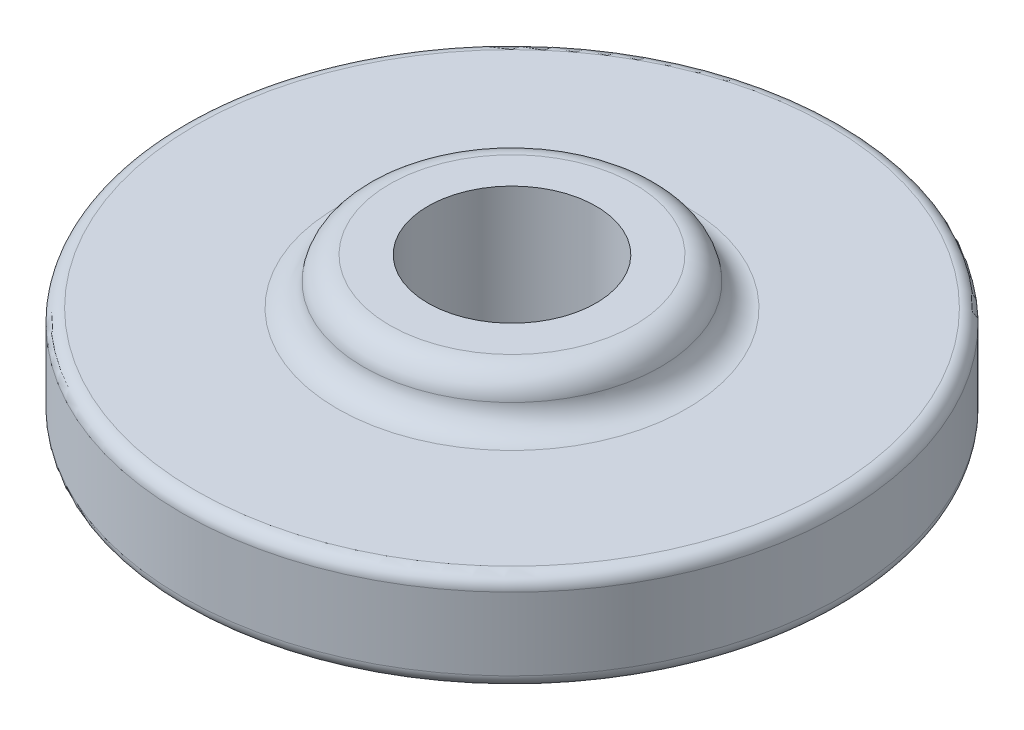
ISO-10303-21;
HEADER;
FILE_DESCRIPTION(('STEP AP214'),'2;1');
FILE_NAME('part.step','',(''),(''),'','','');
FILE_SCHEMA(('AUTOMOTIVE_DESIGN { 1 0 10303 214 1 1 1 1 }'));
ENDSEC;
DATA;
#1=APPLICATION_CONTEXT('core data for automotive mechanical design processes');
#2=APPLICATION_PROTOCOL_DEFINITION('international standard','automotive_design',2000,#1);
#3=PRODUCT_CONTEXT('',#1,'mechanical');
#4=PRODUCT('Part','Part','',(#3));
#5=PRODUCT_RELATED_PRODUCT_CATEGORY('part','',(#4));
#6=PRODUCT_DEFINITION_FORMATION('','',#4);
#7=PRODUCT_DEFINITION_CONTEXT('part definition',#1,'design');
#8=PRODUCT_DEFINITION('design','',#6,#7);
#9=PRODUCT_DEFINITION_SHAPE('','',#8);
#10=(LENGTH_UNIT() NAMED_UNIT(*) SI_UNIT(.MILLI.,.METRE.));
#11=(NAMED_UNIT(*) PLANE_ANGLE_UNIT() SI_UNIT($,.RADIAN.));
#12=(NAMED_UNIT(*) SI_UNIT($,.STERADIAN.) SOLID_ANGLE_UNIT());
#13=UNCERTAINTY_MEASURE_WITH_UNIT(LENGTH_MEASURE(1.E-05),#10,'distance_accuracy_value','');
#14=(GEOMETRIC_REPRESENTATION_CONTEXT(3) GLOBAL_UNCERTAINTY_ASSIGNED_CONTEXT((#13)) GLOBAL_UNIT_ASSIGNED_CONTEXT((#10,
#11,#12)) REPRESENTATION_CONTEXT('',''));
#15=CARTESIAN_POINT('',(0.,0.,0.));
#16=DIRECTION('',(0.,0.,1.));
#17=DIRECTION('',(1.,0.,0.));
#18=AXIS2_PLACEMENT_3D('',#15,#16,#17);
#19=CARTESIAN_POINT('',(0.,3.,0.));
#20=DIRECTION('',(0.,1.,0.));
#21=DIRECTION('',(0.,0.,1.));
#22=AXIS2_PLACEMENT_3D('',#19,#20,#21);
#23=PLANE('',#22);
#24=CARTESIAN_POINT('',(0.,3.,0.));
#25=DIRECTION('',(0.,1.,0.));
#26=DIRECTION('',(0.,0.,1.));
#27=AXIS2_PLACEMENT_3D('',#24,#25,#26);
#28=CIRCLE('',#27,5.3);
#29=CARTESIAN_POINT('',(0.,3.,5.3));
#30=VERTEX_POINT('',#29);
#31=EDGE_CURVE('E42',#30,#30,#28,.F.);
#32=ORIENTED_EDGE('',*,*,#31,.T.);
#33=EDGE_LOOP('',(#32));
#34=FACE_BOUND('',#33,.T.);
#35=CARTESIAN_POINT('',(0.,3.,0.));
#36=DIRECTION('',(0.,1.,0.));
#37=DIRECTION('',(0.,0.,1.));
#38=AXIS2_PLACEMENT_3D('',#35,#36,#37);
#39=CIRCLE('',#38,9.6);
#40=CARTESIAN_POINT('',(0.,3.,9.6));
#41=VERTEX_POINT('',#40);
#42=EDGE_CURVE('E46',#41,#41,#39,.T.);
#43=ORIENTED_EDGE('',*,*,#42,.T.);
#44=EDGE_LOOP('',(#43));
#45=FACE_BOUND('',#44,.T.);
#46=ADVANCED_FACE('F31',(#34,#45),#23,.T.);
#47=CARTESIAN_POINT('',(0.,3.,0.));
#48=DIRECTION('',(0.,-1.,0.));
#49=DIRECTION('',(0.,0.,-1.));
#50=AXIS2_PLACEMENT_3D('',#47,#48,#49);
#51=CYLINDRICAL_SURFACE('',#50,10.);
#52=CARTESIAN_POINT('',(0.,0.4,0.));
#53=DIRECTION('',(0.,1.,0.));
#54=DIRECTION('',(0.,0.,1.));
#55=AXIS2_PLACEMENT_3D('',#52,#53,#54);
#56=CIRCLE('',#55,10.);
#57=CARTESIAN_POINT('',(0.,0.4,10.));
#58=VERTEX_POINT('',#57);
#59=EDGE_CURVE('E54',#58,#58,#56,.T.);
#60=ORIENTED_EDGE('',*,*,#59,.T.);
#61=EDGE_LOOP('',(#60));
#62=FACE_BOUND('',#61,.T.);
#63=CARTESIAN_POINT('',(0.,2.6,0.));
#64=DIRECTION('',(0.,1.,0.));
#65=DIRECTION('',(0.,0.,1.));
#66=AXIS2_PLACEMENT_3D('',#63,#64,#65);
#67=CIRCLE('',#66,10.);
#68=CARTESIAN_POINT('',(0.,2.6,10.));
#69=VERTEX_POINT('',#68);
#70=EDGE_CURVE('E57',#69,#69,#67,.F.);
#71=ORIENTED_EDGE('',*,*,#70,.T.);
#72=EDGE_LOOP('',(#71));
#73=FACE_BOUND('',#72,.T.);
#74=ADVANCED_FACE('F84',(#62,#73),#51,.T.);
#75=CARTESIAN_POINT('',(0.,0.,0.));
#76=DIRECTION('',(0.,1.,0.));
#77=DIRECTION('',(0.,0.,1.));
#78=AXIS2_PLACEMENT_3D('',#75,#76,#77);
#79=PLANE('',#78);
#80=CARTESIAN_POINT('',(0.,0.,0.));
#81=DIRECTION('',(0.,1.,0.));
#82=DIRECTION('',(0.,0.,1.));
#83=AXIS2_PLACEMENT_3D('',#80,#81,#82);
#84=CIRCLE('',#83,9.6);
#85=CARTESIAN_POINT('',(0.,0.,9.6));
#86=VERTEX_POINT('',#85);
#87=EDGE_CURVE('E51',#86,#86,#84,.F.);
#88=ORIENTED_EDGE('',*,*,#87,.T.);
#89=EDGE_LOOP('',(#88));
#90=FACE_BOUND('',#89,.T.);
#91=ADVANCED_FACE('F90',(#90),#79,.F.);
#92=CARTESIAN_POINT('',(0.,0.4,0.));
#93=DIRECTION('',(0.,1.,0.));
#94=DIRECTION('',(0.,0.,1.));
#95=AXIS2_PLACEMENT_3D('',#92,#93,#94);
#96=TOROIDAL_SURFACE('',#95,9.6,0.4);
#97=ORIENTED_EDGE('',*,*,#87,.F.);
#98=EDGE_LOOP('',(#97));
#99=FACE_BOUND('',#98,.T.);
#100=ORIENTED_EDGE('',*,*,#59,.F.);
#101=EDGE_LOOP('',(#100));
#102=FACE_BOUND('',#101,.T.);
#103=ADVANCED_FACE('F80',(#99,#102),#96,.T.);
#104=CARTESIAN_POINT('',(0.,2.6,0.));
#105=DIRECTION('',(0.,1.,0.));
#106=DIRECTION('',(0.,0.,1.));
#107=AXIS2_PLACEMENT_3D('',#104,#105,#106);
#108=TOROIDAL_SURFACE('',#107,9.6,0.4);
#109=ORIENTED_EDGE('',*,*,#70,.F.);
#110=EDGE_LOOP('',(#109));
#111=FACE_BOUND('',#110,.T.);
#112=ORIENTED_EDGE('',*,*,#42,.F.);
#113=EDGE_LOOP('',(#112));
#114=FACE_BOUND('',#113,.T.);
#115=ADVANCED_FACE('F72',(#111,#114),#108,.T.);
#116=CARTESIAN_POINT('',(0.,4.4,0.));
#117=DIRECTION('',(0.,1.,0.));
#118=DIRECTION('',(0.,0.,1.));
#119=AXIS2_PLACEMENT_3D('',#116,#117,#118);
#120=PLANE('',#119);
#121=CARTESIAN_POINT('',(0.,4.4,0.));
#122=DIRECTION('',(0.,1.,0.));
#123=DIRECTION('',(0.,0.,1.));
#124=AXIS2_PLACEMENT_3D('',#121,#122,#123);
#125=CIRCLE('',#124,3.71254921336125);
#126=CARTESIAN_POINT('',(0.,4.4,3.71254921336125));
#127=VERTEX_POINT('',#126);
#128=EDGE_CURVE('E38',#127,#127,#125,.T.);
#129=ORIENTED_EDGE('',*,*,#128,.T.);
#130=EDGE_LOOP('',(#129));
#131=FACE_BOUND('',#130,.T.);
#132=CARTESIAN_POINT('',(0.,4.4,0.));
#133=DIRECTION('',(0.,1.,0.));
#134=DIRECTION('',(0.,0.,1.));
#135=AXIS2_PLACEMENT_3D('',#132,#133,#134);
#136=CIRCLE('',#135,2.55);
#137=CARTESIAN_POINT('',(0.,4.4,2.55));
#138=VERTEX_POINT('',#137);
#139=EDGE_CURVE('E63',#138,#138,#136,.T.);
#140=ORIENTED_EDGE('',*,*,#139,.F.);
#141=EDGE_LOOP('',(#140));
#142=FACE_BOUND('',#141,.T.);
#143=ADVANCED_FACE('F69',(#131,#142),#120,.T.);
#144=CARTESIAN_POINT('',(0.,0.4,0.));
#145=DIRECTION('',(0.,1.,0.));
#146=DIRECTION('',(0.,0.,1.));
#147=AXIS2_PLACEMENT_3D('',#144,#145,#146);
#148=PLANE('',#147);
#149=CARTESIAN_POINT('',(0.,0.4,0.));
#150=DIRECTION('',(0.,1.,0.));
#151=DIRECTION('',(0.,0.,1.));
#152=AXIS2_PLACEMENT_3D('',#149,#150,#151);
#153=CIRCLE('',#152,2.55);
#154=CARTESIAN_POINT('',(0.,0.4,2.55));
#155=VERTEX_POINT('',#154);
#156=EDGE_CURVE('E60',#155,#155,#153,.T.);
#157=ORIENTED_EDGE('',*,*,#156,.T.);
#158=EDGE_LOOP('',(#157));
#159=FACE_BOUND('',#158,.T.);
#160=ADVANCED_FACE('F71',(#159),#148,.T.);
#161=CARTESIAN_POINT('',(0.,0.4,0.));
#162=DIRECTION('',(0.,1.,0.));
#163=DIRECTION('',(0.,0.,1.));
#164=AXIS2_PLACEMENT_3D('',#161,#162,#163);
#165=CYLINDRICAL_SURFACE('',#164,2.55);
#166=ORIENTED_EDGE('',*,*,#156,.F.);
#167=EDGE_LOOP('',(#166));
#168=FACE_BOUND('',#167,.T.);
#169=ORIENTED_EDGE('',*,*,#139,.T.);
#170=EDGE_LOOP('',(#169));
#171=FACE_BOUND('',#170,.T.);
#172=ADVANCED_FACE('F67',(#168,#171),#165,.F.);
#173=CARTESIAN_POINT('',(0.,3.8,0.));
#174=DIRECTION('',(0.,1.,0.));
#175=DIRECTION('',(0.,0.,1.));
#176=AXIS2_PLACEMENT_3D('',#173,#174,#175);
#177=TOROIDAL_SURFACE('',#176,5.3,0.8);
#178=CARTESIAN_POINT('',(0.,3.7,0.));
#179=DIRECTION('',(0.,1.,0.));
#180=DIRECTION('',(0.,0.,1.));
#181=AXIS2_PLACEMENT_3D('',#178,#179,#180);
#182=CIRCLE('',#181,4.50627460668063);
#183=CARTESIAN_POINT('',(0.,3.7,4.50627460668063));
#184=VERTEX_POINT('',#183);
#185=EDGE_CURVE('E10',#184,#184,#182,.F.);
#186=ORIENTED_EDGE('',*,*,#185,.T.);
#187=EDGE_LOOP('',(#186));
#188=FACE_BOUND('',#187,.T.);
#189=ORIENTED_EDGE('',*,*,#31,.F.);
#190=EDGE_LOOP('',(#189));
#191=FACE_BOUND('',#190,.T.);
#192=ADVANCED_FACE('F101',(#188,#191),#177,.F.);
#193=CARTESIAN_POINT('',(0.,3.6,0.));
#194=DIRECTION('',(0.,-1.,0.));
#195=DIRECTION('',(0.,0.,-1.));
#196=AXIS2_PLACEMENT_3D('',#193,#194,#195);
#197=TOROIDAL_SURFACE('',#196,3.71254921336125,0.8);
#198=ORIENTED_EDGE('',*,*,#185,.F.);
#199=EDGE_LOOP('',(#198));
#200=FACE_BOUND('',#199,.T.);
#201=ORIENTED_EDGE('',*,*,#128,.F.);
#202=EDGE_LOOP('',(#201));
#203=FACE_BOUND('',#202,.T.);
#204=ADVANCED_FACE('F33',(#200,#203),#197,.T.);
#205=CLOSED_SHELL('',(#46,#74,#91,#103,#115,#143,#160,#172,#192,#204));
#206=MANIFOLD_SOLID_BREP('B2',#205);
#207=ADVANCED_BREP_SHAPE_REPRESENTATION('',(#18,#206),#14);
#208=SHAPE_DEFINITION_REPRESENTATION(#9,#207);
ENDSEC;
END-ISO-10303-21;
